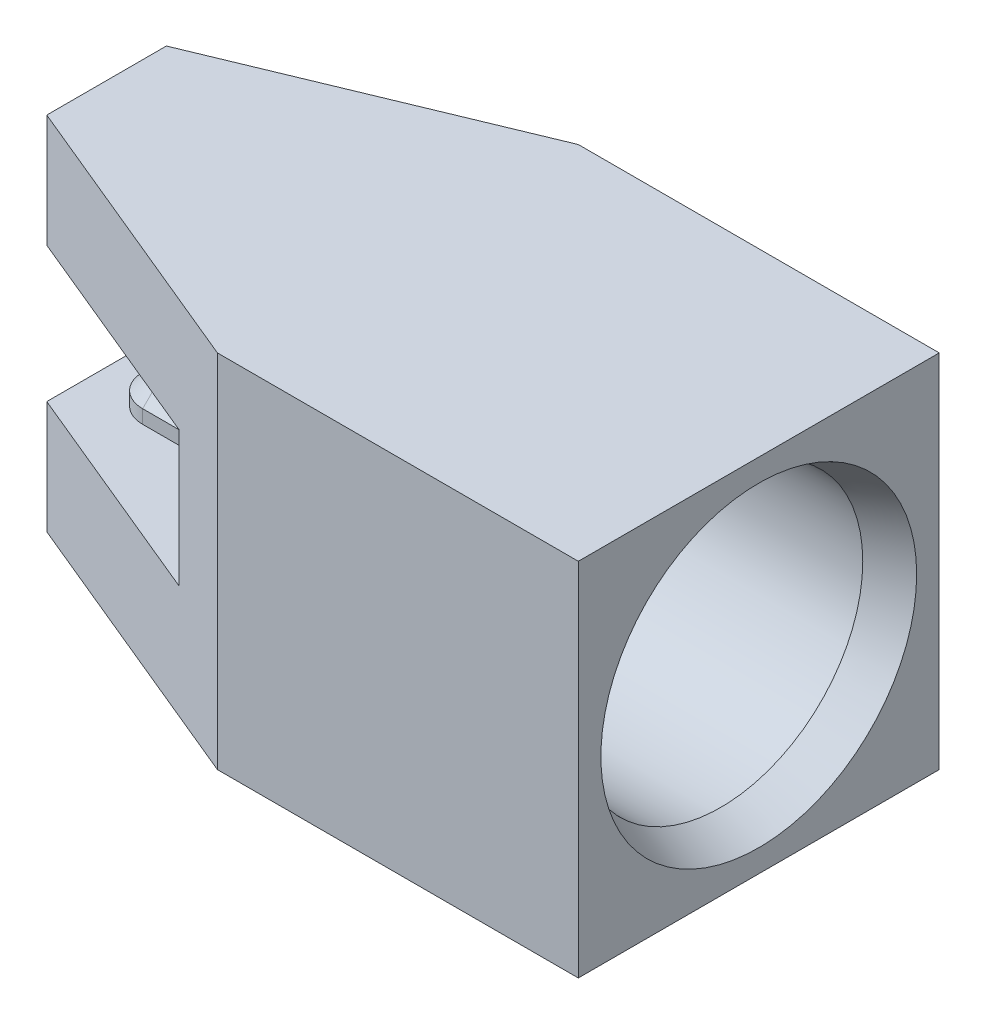
ISO-10303-21;
HEADER;
FILE_DESCRIPTION(('STEP AP214'),'2;1');
FILE_NAME('part.step','',(''),(''),'','','');
FILE_SCHEMA(('AUTOMOTIVE_DESIGN { 1 0 10303 214 1 1 1 1 }'));
ENDSEC;
DATA;
#1=APPLICATION_CONTEXT('core data for automotive mechanical design processes');
#2=APPLICATION_PROTOCOL_DEFINITION('international standard','automotive_design',2000,#1);
#3=PRODUCT_CONTEXT('',#1,'mechanical');
#4=PRODUCT('Part','Part','',(#3));
#5=PRODUCT_RELATED_PRODUCT_CATEGORY('part','',(#4));
#6=PRODUCT_DEFINITION_FORMATION('','',#4);
#7=PRODUCT_DEFINITION_CONTEXT('part definition',#1,'design');
#8=PRODUCT_DEFINITION('design','',#6,#7);
#9=PRODUCT_DEFINITION_SHAPE('','',#8);
#10=(LENGTH_UNIT() NAMED_UNIT(*) SI_UNIT(.MILLI.,.METRE.));
#11=(NAMED_UNIT(*) PLANE_ANGLE_UNIT() SI_UNIT($,.RADIAN.));
#12=(NAMED_UNIT(*) SI_UNIT($,.STERADIAN.) SOLID_ANGLE_UNIT());
#13=UNCERTAINTY_MEASURE_WITH_UNIT(LENGTH_MEASURE(1.E-05),#10,'distance_accuracy_value','');
#14=(GEOMETRIC_REPRESENTATION_CONTEXT(3) GLOBAL_UNCERTAINTY_ASSIGNED_CONTEXT((#13)) GLOBAL_UNIT_ASSIGNED_CONTEXT((#10,
#11,#12)) REPRESENTATION_CONTEXT('',''));
#15=CARTESIAN_POINT('',(0.,0.,0.));
#16=DIRECTION('',(0.,0.,1.));
#17=DIRECTION('',(1.,0.,0.));
#18=AXIS2_PLACEMENT_3D('',#15,#16,#17);
#19=CARTESIAN_POINT('',(0.,1.5,-4.));
#20=DIRECTION('',(0.,1.,0.));
#21=DIRECTION('',(-1.,0.,0.));
#22=AXIS2_PLACEMENT_3D('',#19,#20,#21);
#23=PLANE('',#22);
#24=DIRECTION('',(0.923879532511288,0.,0.382683432365087));
#25=VECTOR('',#24,1.);
#26=CARTESIAN_POINT('',(9.65685424949246,1.50000000000001,4.));
#27=LINE('',#26,#25);
#28=CARTESIAN_POINT('',(3.2,1.50000000000001,1.32548339959389));
#29=VERTEX_POINT('',#28);
#30=CARTESIAN_POINT('',(8.2,1.50000000000001,3.39655121145935));
#31=VERTEX_POINT('',#30);
#32=EDGE_CURVE('E312',#29,#31,#27,.T.);
#33=ORIENTED_EDGE('',*,*,#32,.F.);
#34=DIRECTION('',(0.,0.,-1.));
#35=VECTOR('',#34,1.);
#36=CARTESIAN_POINT('',(3.2,1.5,-4.));
#37=LINE('',#36,#35);
#38=CARTESIAN_POINT('',(3.2,1.5,-1.32548339959389));
#39=VERTEX_POINT('',#38);
#40=EDGE_CURVE('E209',#29,#39,#37,.T.);
#41=ORIENTED_EDGE('',*,*,#40,.T.);
#42=DIRECTION('',(-0.923879532511288,0.,0.382683432365087));
#43=VECTOR('',#42,1.);
#44=CARTESIAN_POINT('',(2.95641450403612,1.5,-1.22458698356828));
#45=LINE('',#44,#43);
#46=CARTESIAN_POINT('',(8.2,1.50000000000001,-3.39655121145935));
#47=VERTEX_POINT('',#46);
#48=EDGE_CURVE('E267',#47,#39,#45,.T.);
#49=ORIENTED_EDGE('',*,*,#48,.F.);
#50=DIRECTION('',(0.,0.,1.));
#51=VECTOR('',#50,1.);
#52=CARTESIAN_POINT('',(8.2,1.50000000000001,-4.));
#53=LINE('',#52,#51);
#54=EDGE_CURVE('E257',#47,#31,#53,.T.);
#55=ORIENTED_EDGE('',*,*,#54,.T.);
#56=EDGE_LOOP('',(#33,#41,#49,#55));
#57=FACE_BOUND('',#56,.T.);
#58=CARTESIAN_POINT('',(4.7,1.5,0.));
#59=DIRECTION('',(0.,-1.,0.));
#60=DIRECTION('',(0.,0.,-1.));
#61=AXIS2_PLACEMENT_3D('',#58,#59,#60);
#62=CIRCLE('',#61,0.7);
#63=CARTESIAN_POINT('',(4.7,1.5,0.7));
#64=VERTEX_POINT('',#63);
#65=CARTESIAN_POINT('',(4.7,1.5,-0.7));
#66=VERTEX_POINT('',#65);
#67=EDGE_CURVE('E235',#64,#66,#62,.T.);
#68=ORIENTED_EDGE('',*,*,#67,.F.);
#69=DIRECTION('',(-1.,0.,0.));
#70=VECTOR('',#69,1.);
#71=CARTESIAN_POINT('',(4.7,1.5,0.7));
#72=LINE('',#71,#70);
#73=CARTESIAN_POINT('',(5.5,1.5,0.7));
#74=VERTEX_POINT('',#73);
#75=EDGE_CURVE('E245',#74,#64,#72,.T.);
#76=ORIENTED_EDGE('',*,*,#75,.F.);
#77=CARTESIAN_POINT('',(5.5,1.5,0.));
#78=DIRECTION('',(0.,-1.,0.));
#79=DIRECTION('',(0.,0.,-1.));
#80=AXIS2_PLACEMENT_3D('',#77,#78,#79);
#81=CIRCLE('',#80,0.7);
#82=CARTESIAN_POINT('',(5.5,1.5,-0.7));
#83=VERTEX_POINT('',#82);
#84=EDGE_CURVE('E242',#83,#74,#81,.T.);
#85=ORIENTED_EDGE('',*,*,#84,.F.);
#86=DIRECTION('',(1.,0.,0.));
#87=VECTOR('',#86,1.);
#88=CARTESIAN_POINT('',(4.7,1.5,-0.7));
#89=LINE('',#88,#87);
#90=EDGE_CURVE('E238',#66,#83,#89,.T.);
#91=ORIENTED_EDGE('',*,*,#90,.F.);
#92=EDGE_LOOP('',(#68,#76,#85,#91));
#93=FACE_BOUND('',#92,.T.);
#94=ADVANCED_FACE('F33',(#57,#93),#23,.F.);
#95=CARTESIAN_POINT('',(17.6568542494925,4.,-4.));
#96=DIRECTION('',(-1.,0.,0.));
#97=DIRECTION('',(0.,0.,1.));
#98=AXIS2_PLACEMENT_3D('',#95,#96,#97);
#99=PLANE('',#98);
#100=CARTESIAN_POINT('',(17.6568542494925,0.,0.));
#101=DIRECTION('',(1.,0.,0.));
#102=DIRECTION('',(0.,0.,-1.));
#103=AXIS2_PLACEMENT_3D('',#100,#101,#102);
#104=CIRCLE('',#103,3.5);
#105=CARTESIAN_POINT('',(17.6568542494925,0.,-3.5));
#106=VERTEX_POINT('',#105);
#107=EDGE_CURVE('E198',#106,#106,#104,.T.);
#108=ORIENTED_EDGE('',*,*,#107,.F.);
#109=EDGE_LOOP('',(#108));
#110=FACE_BOUND('',#109,.T.);
#111=DIRECTION('',(0.,0.,-1.));
#112=VECTOR('',#111,1.);
#113=CARTESIAN_POINT('',(17.6568542494925,-4.,-4.));
#114=LINE('',#113,#112);
#115=CARTESIAN_POINT('',(17.6568542494925,-4.,4.));
#116=VERTEX_POINT('',#115);
#117=CARTESIAN_POINT('',(17.6568542494925,-4.,-4.));
#118=VERTEX_POINT('',#117);
#119=EDGE_CURVE('E270',#116,#118,#114,.T.);
#120=ORIENTED_EDGE('',*,*,#119,.T.);
#121=DIRECTION('',(0.,-1.,0.));
#122=VECTOR('',#121,1.);
#123=CARTESIAN_POINT('',(17.6568542494925,4.,-4.));
#124=LINE('',#123,#122);
#125=CARTESIAN_POINT('',(17.6568542494925,4.,-4.));
#126=VERTEX_POINT('',#125);
#127=EDGE_CURVE('E303',#126,#118,#124,.T.);
#128=ORIENTED_EDGE('',*,*,#127,.F.);
#129=DIRECTION('',(0.,0.,-1.));
#130=VECTOR('',#129,1.);
#131=CARTESIAN_POINT('',(17.6568542494925,4.,-4.));
#132=LINE('',#131,#130);
#133=CARTESIAN_POINT('',(17.6568542494925,4.,4.));
#134=VERTEX_POINT('',#133);
#135=EDGE_CURVE('E271',#134,#126,#132,.T.);
#136=ORIENTED_EDGE('',*,*,#135,.F.);
#137=DIRECTION('',(0.,-1.,0.));
#138=VECTOR('',#137,1.);
#139=CARTESIAN_POINT('',(17.6568542494925,4.,4.));
#140=LINE('',#139,#138);
#141=EDGE_CURVE('E284',#134,#116,#140,.T.);
#142=ORIENTED_EDGE('',*,*,#141,.T.);
#143=EDGE_LOOP('',(#120,#128,#136,#142));
#144=FACE_BOUND('',#143,.T.);
#145=ADVANCED_FACE('F409',(#110,#144),#99,.F.);
#146=CARTESIAN_POINT('',(9.65685424949246,4.,-4.));
#147=DIRECTION('',(0.,0.,1.));
#148=DIRECTION('',(1.,0.,0.));
#149=AXIS2_PLACEMENT_3D('',#146,#147,#148);
#150=PLANE('',#149);
#151=DIRECTION('',(-1.,0.,0.));
#152=VECTOR('',#151,1.);
#153=CARTESIAN_POINT('',(9.65685424949246,-4.,-4.));
#154=LINE('',#153,#152);
#155=CARTESIAN_POINT('',(9.65685424949246,-4.,-4.));
#156=VERTEX_POINT('',#155);
#157=EDGE_CURVE('E287',#118,#156,#154,.T.);
#158=ORIENTED_EDGE('',*,*,#157,.T.);
#159=DIRECTION('',(0.,-1.,0.));
#160=VECTOR('',#159,1.);
#161=CARTESIAN_POINT('',(9.65685424949246,4.,-4.));
#162=LINE('',#161,#160);
#163=CARTESIAN_POINT('',(9.65685424949246,4.,-4.));
#164=VERTEX_POINT('',#163);
#165=EDGE_CURVE('E300',#164,#156,#162,.T.);
#166=ORIENTED_EDGE('',*,*,#165,.F.);
#167=DIRECTION('',(-1.,0.,0.));
#168=VECTOR('',#167,1.);
#169=CARTESIAN_POINT('',(9.65685424949246,4.,-4.));
#170=LINE('',#169,#168);
#171=EDGE_CURVE('E274',#126,#164,#170,.T.);
#172=ORIENTED_EDGE('',*,*,#171,.F.);
#173=ORIENTED_EDGE('',*,*,#127,.T.);
#174=EDGE_LOOP('',(#158,#166,#172,#173));
#175=FACE_BOUND('',#174,.T.);
#176=ADVANCED_FACE('F415',(#175),#150,.F.);
#177=CARTESIAN_POINT('',(2.95641450403612,4.,-1.22458698356828));
#178=DIRECTION('',(0.382683432365087,0.,0.923879532511288));
#179=DIRECTION('',(0.923879532511288,0.,-0.382683432365087));
#180=AXIS2_PLACEMENT_3D('',#177,#178,#179);
#181=PLANE('',#180);
#182=DIRECTION('',(-0.923879532511288,0.,0.382683432365087));
#183=VECTOR('',#182,1.);
#184=CARTESIAN_POINT('',(2.95641450403612,-4.,-1.22458698356828));
#185=LINE('',#184,#183);
#186=CARTESIAN_POINT('',(3.2,-4.,-1.32548339959389));
#187=VERTEX_POINT('',#186);
#188=EDGE_CURVE('E289',#156,#187,#185,.T.);
#189=ORIENTED_EDGE('',*,*,#188,.T.);
#190=DIRECTION('',(0.,1.,0.));
#191=VECTOR('',#190,1.);
#192=CARTESIAN_POINT('',(3.2,4.,-1.32548339959389));
#193=LINE('',#192,#191);
#194=CARTESIAN_POINT('',(3.2,-1.5,-1.32548339959389));
#195=VERTEX_POINT('',#194);
#196=EDGE_CURVE('E204',#187,#195,#193,.T.);
#197=ORIENTED_EDGE('',*,*,#196,.T.);
#198=DIRECTION('',(0.923879532511288,0.,-0.382683432365087));
#199=VECTOR('',#198,1.);
#200=CARTESIAN_POINT('',(2.95641450403612,-1.5,-1.22458698356828));
#201=LINE('',#200,#199);
#202=CARTESIAN_POINT('',(8.2,-1.5,-3.39655121145935));
#203=VERTEX_POINT('',#202);
#204=EDGE_CURVE('E260',#195,#203,#201,.T.);
#205=ORIENTED_EDGE('',*,*,#204,.T.);
#206=DIRECTION('',(0.,1.,0.));
#207=VECTOR('',#206,1.);
#208=CARTESIAN_POINT('',(8.2,4.,-3.39655121145935));
#209=LINE('',#208,#207);
#210=EDGE_CURVE('E264',#203,#47,#209,.T.);
#211=ORIENTED_EDGE('',*,*,#210,.T.);
#212=ORIENTED_EDGE('',*,*,#48,.T.);
#213=CARTESIAN_POINT('',(3.2,4.,-1.32548339959389));
#214=VERTEX_POINT('',#213);
#215=EDGE_CURVE('E208',#39,#214,#193,.T.);
#216=ORIENTED_EDGE('',*,*,#215,.T.);
#217=DIRECTION('',(-0.923879532511288,0.,0.382683432365087));
#218=VECTOR('',#217,1.);
#219=CARTESIAN_POINT('',(2.95641450403612,4.,-1.22458698356828));
#220=LINE('',#219,#218);
#221=EDGE_CURVE('E277',#164,#214,#220,.T.);
#222=ORIENTED_EDGE('',*,*,#221,.F.);
#223=ORIENTED_EDGE('',*,*,#165,.T.);
#224=EDGE_LOOP('',(#189,#197,#205,#211,#212,#216,#222,#223));
#225=FACE_BOUND('',#224,.T.);
#226=ADVANCED_FACE('F445',(#225),#181,.F.);
#227=CARTESIAN_POINT('',(9.65685424949246,4.,4.));
#228=DIRECTION('',(0.382683432365087,0.,-0.923879532511288));
#229=DIRECTION('',(-0.923879532511288,0.,-0.382683432365087));
#230=AXIS2_PLACEMENT_3D('',#227,#228,#229);
#231=PLANE('',#230);
#232=DIRECTION('',(0.923879532511288,0.,0.382683432365087));
#233=VECTOR('',#232,1.);
#234=CARTESIAN_POINT('',(9.65685424949246,4.,4.));
#235=LINE('',#234,#233);
#236=CARTESIAN_POINT('',(3.2,4.,1.32548339959389));
#237=VERTEX_POINT('',#236);
#238=CARTESIAN_POINT('',(9.65685424949246,4.,4.));
#239=VERTEX_POINT('',#238);
#240=EDGE_CURVE('E280',#237,#239,#235,.T.);
#241=ORIENTED_EDGE('',*,*,#240,.F.);
#242=DIRECTION('',(0.,-1.,0.));
#243=VECTOR('',#242,1.);
#244=CARTESIAN_POINT('',(3.2,4.,1.32548339959389));
#245=LINE('',#244,#243);
#246=EDGE_CURVE('E205',#237,#29,#245,.T.);
#247=ORIENTED_EDGE('',*,*,#246,.T.);
#248=ORIENTED_EDGE('',*,*,#32,.T.);
#249=DIRECTION('',(0.,-1.,0.));
#250=VECTOR('',#249,1.);
#251=CARTESIAN_POINT('',(8.2,4.,3.39655121145935));
#252=LINE('',#251,#250);
#253=CARTESIAN_POINT('',(8.2,-1.5,3.39655121145935));
#254=VERTEX_POINT('',#253);
#255=EDGE_CURVE('E309',#31,#254,#252,.T.);
#256=ORIENTED_EDGE('',*,*,#255,.T.);
#257=DIRECTION('',(-0.923879532511288,0.,-0.382683432365087));
#258=VECTOR('',#257,1.);
#259=CARTESIAN_POINT('',(9.65685424949246,-1.5,4.));
#260=LINE('',#259,#258);
#261=CARTESIAN_POINT('',(3.2,-1.5,1.32548339959389));
#262=VERTEX_POINT('',#261);
#263=EDGE_CURVE('E306',#254,#262,#260,.T.);
#264=ORIENTED_EDGE('',*,*,#263,.T.);
#265=CARTESIAN_POINT('',(3.2,-4.,1.32548339959389));
#266=VERTEX_POINT('',#265);
#267=EDGE_CURVE('E48',#262,#266,#245,.T.);
#268=ORIENTED_EDGE('',*,*,#267,.T.);
#269=DIRECTION('',(0.923879532511288,0.,0.382683432365087));
#270=VECTOR('',#269,1.);
#271=CARTESIAN_POINT('',(9.65685424949246,-4.,4.));
#272=LINE('',#271,#270);
#273=CARTESIAN_POINT('',(9.65685424949246,-4.,4.));
#274=VERTEX_POINT('',#273);
#275=EDGE_CURVE('E292',#266,#274,#272,.T.);
#276=ORIENTED_EDGE('',*,*,#275,.T.);
#277=DIRECTION('',(0.,-1.,0.));
#278=VECTOR('',#277,1.);
#279=CARTESIAN_POINT('',(9.65685424949246,4.,4.));
#280=LINE('',#279,#278);
#281=EDGE_CURVE('E297',#239,#274,#280,.T.);
#282=ORIENTED_EDGE('',*,*,#281,.F.);
#283=EDGE_LOOP('',(#241,#247,#248,#256,#264,#268,#276,#282));
#284=FACE_BOUND('',#283,.T.);
#285=ADVANCED_FACE('F441',(#284),#231,.F.);
#286=CARTESIAN_POINT('',(17.6568542494925,4.,4.));
#287=DIRECTION('',(0.,0.,-1.));
#288=DIRECTION('',(-1.,0.,0.));
#289=AXIS2_PLACEMENT_3D('',#286,#287,#288);
#290=PLANE('',#289);
#291=DIRECTION('',(1.,0.,0.));
#292=VECTOR('',#291,1.);
#293=CARTESIAN_POINT('',(17.6568542494925,-4.,4.));
#294=LINE('',#293,#292);
#295=EDGE_CURVE('E275',#274,#116,#294,.T.);
#296=ORIENTED_EDGE('',*,*,#295,.T.);
#297=ORIENTED_EDGE('',*,*,#141,.F.);
#298=DIRECTION('',(1.,0.,0.));
#299=VECTOR('',#298,1.);
#300=CARTESIAN_POINT('',(17.6568542494925,4.,4.));
#301=LINE('',#300,#299);
#302=EDGE_CURVE('E282',#239,#134,#301,.T.);
#303=ORIENTED_EDGE('',*,*,#302,.F.);
#304=ORIENTED_EDGE('',*,*,#281,.T.);
#305=EDGE_LOOP('',(#296,#297,#303,#304));
#306=FACE_BOUND('',#305,.T.);
#307=ADVANCED_FACE('F434',(#306),#290,.F.);
#308=CARTESIAN_POINT('',(0.,4.,0.));
#309=DIRECTION('',(0.,1.,0.));
#310=DIRECTION('',(0.,0.,1.));
#311=AXIS2_PLACEMENT_3D('',#308,#309,#310);
#312=PLANE('',#311);
#313=DIRECTION('',(0.,0.,-1.));
#314=VECTOR('',#313,1.);
#315=CARTESIAN_POINT('',(3.2,4.,-4.));
#316=LINE('',#315,#314);
#317=EDGE_CURVE('E192',#237,#214,#316,.T.);
#318=ORIENTED_EDGE('',*,*,#317,.F.);
#319=ORIENTED_EDGE('',*,*,#240,.T.);
#320=ORIENTED_EDGE('',*,*,#302,.T.);
#321=ORIENTED_EDGE('',*,*,#135,.T.);
#322=ORIENTED_EDGE('',*,*,#171,.T.);
#323=ORIENTED_EDGE('',*,*,#221,.T.);
#324=EDGE_LOOP('',(#318,#319,#320,#321,#322,#323));
#325=FACE_BOUND('',#324,.T.);
#326=ADVANCED_FACE('F431',(#325),#312,.T.);
#327=CARTESIAN_POINT('',(0.,-4.,0.));
#328=DIRECTION('',(0.,1.,0.));
#329=DIRECTION('',(0.,0.,1.));
#330=AXIS2_PLACEMENT_3D('',#327,#328,#329);
#331=PLANE('',#330);
#332=ORIENTED_EDGE('',*,*,#275,.F.);
#333=DIRECTION('',(0.,0.,-1.));
#334=VECTOR('',#333,1.);
#335=CARTESIAN_POINT('',(3.2,-4.,-4.));
#336=LINE('',#335,#334);
#337=EDGE_CURVE('E195',#266,#187,#336,.T.);
#338=ORIENTED_EDGE('',*,*,#337,.T.);
#339=ORIENTED_EDGE('',*,*,#188,.F.);
#340=ORIENTED_EDGE('',*,*,#157,.F.);
#341=ORIENTED_EDGE('',*,*,#119,.F.);
#342=ORIENTED_EDGE('',*,*,#295,.F.);
#343=EDGE_LOOP('',(#332,#338,#339,#340,#341,#342));
#344=FACE_BOUND('',#343,.T.);
#345=ADVANCED_FACE('F427',(#344),#331,.F.);
#346=CARTESIAN_POINT('',(8.2,1.50000000000001,-4.));
#347=DIRECTION('',(1.,0.,0.));
#348=DIRECTION('',(0.,1.,0.));
#349=AXIS2_PLACEMENT_3D('',#346,#347,#348);
#350=PLANE('',#349);
#351=DIRECTION('',(0.,0.,1.));
#352=VECTOR('',#351,1.);
#353=CARTESIAN_POINT('',(8.2,-1.5,-4.));
#354=LINE('',#353,#352);
#355=EDGE_CURVE('E256',#203,#254,#354,.T.);
#356=ORIENTED_EDGE('',*,*,#355,.T.);
#357=ORIENTED_EDGE('',*,*,#255,.F.);
#358=ORIENTED_EDGE('',*,*,#54,.F.);
#359=ORIENTED_EDGE('',*,*,#210,.F.);
#360=EDGE_LOOP('',(#356,#357,#358,#359));
#361=FACE_BOUND('',#360,.T.);
#362=ADVANCED_FACE('F424',(#361),#350,.F.);
#363=CARTESIAN_POINT('',(0.,-1.5,-4.));
#364=DIRECTION('',(0.,-1.,0.));
#365=DIRECTION('',(0.,0.,-1.));
#366=AXIS2_PLACEMENT_3D('',#363,#364,#365);
#367=PLANE('',#366);
#368=DIRECTION('',(-1.,0.,0.));
#369=VECTOR('',#368,1.);
#370=CARTESIAN_POINT('',(4.7,-1.5,0.7));
#371=LINE('',#370,#369);
#372=CARTESIAN_POINT('',(5.5,-1.5,0.7));
#373=VERTEX_POINT('',#372);
#374=CARTESIAN_POINT('',(4.7,-1.5,0.7));
#375=VERTEX_POINT('',#374);
#376=EDGE_CURVE('E216',#373,#375,#371,.T.);
#377=ORIENTED_EDGE('',*,*,#376,.T.);
#378=CARTESIAN_POINT('',(4.7,-1.5,0.));
#379=DIRECTION('',(0.,-1.,0.));
#380=DIRECTION('',(0.,0.,-1.));
#381=AXIS2_PLACEMENT_3D('',#378,#379,#380);
#382=CIRCLE('',#381,0.7);
#383=CARTESIAN_POINT('',(4.7,-1.5,-0.7));
#384=VERTEX_POINT('',#383);
#385=EDGE_CURVE('E213',#375,#384,#382,.T.);
#386=ORIENTED_EDGE('',*,*,#385,.T.);
#387=DIRECTION('',(1.,0.,0.));
#388=VECTOR('',#387,1.);
#389=CARTESIAN_POINT('',(4.7,-1.5,-0.7));
#390=LINE('',#389,#388);
#391=CARTESIAN_POINT('',(5.5,-1.5,-0.7));
#392=VERTEX_POINT('',#391);
#393=EDGE_CURVE('E223',#384,#392,#390,.T.);
#394=ORIENTED_EDGE('',*,*,#393,.T.);
#395=CARTESIAN_POINT('',(5.5,-1.5,0.));
#396=DIRECTION('',(0.,-1.,0.));
#397=DIRECTION('',(0.,0.,-1.));
#398=AXIS2_PLACEMENT_3D('',#395,#396,#397);
#399=CIRCLE('',#398,0.7);
#400=EDGE_CURVE('E220',#392,#373,#399,.T.);
#401=ORIENTED_EDGE('',*,*,#400,.T.);
#402=EDGE_LOOP('',(#377,#386,#394,#401));
#403=FACE_BOUND('',#402,.T.);
#404=ORIENTED_EDGE('',*,*,#204,.F.);
#405=DIRECTION('',(0.,0.,1.));
#406=VECTOR('',#405,1.);
#407=CARTESIAN_POINT('',(3.2,-1.5,-4.));
#408=LINE('',#407,#406);
#409=EDGE_CURVE('E11',#195,#262,#408,.T.);
#410=ORIENTED_EDGE('',*,*,#409,.T.);
#411=ORIENTED_EDGE('',*,*,#263,.F.);
#412=ORIENTED_EDGE('',*,*,#355,.F.);
#413=EDGE_LOOP('',(#404,#410,#411,#412));
#414=FACE_BOUND('',#413,.T.);
#415=ADVANCED_FACE('F393',(#403,#414),#367,.F.);
#416=CARTESIAN_POINT('',(4.7,0.9,0.));
#417=DIRECTION('',(0.,1.,0.));
#418=DIRECTION('',(0.,0.,1.));
#419=AXIS2_PLACEMENT_3D('',#416,#417,#418);
#420=CYLINDRICAL_SURFACE('',#419,0.7);
#421=DIRECTION('',(0.,1.,0.));
#422=VECTOR('',#421,1.);
#423=CARTESIAN_POINT('',(4.7,0.9,-0.7));
#424=LINE('',#423,#422);
#425=CARTESIAN_POINT('',(4.7,1.2,-0.7));
#426=VERTEX_POINT('',#425);
#427=EDGE_CURVE('E254',#426,#66,#424,.T.);
#428=ORIENTED_EDGE('',*,*,#427,.F.);
#429=CARTESIAN_POINT('',(4.7,1.2,0.));
#430=DIRECTION('',(0.,-1.,0.));
#431=DIRECTION('',(0.,0.,-1.));
#432=AXIS2_PLACEMENT_3D('',#429,#430,#431);
#433=CIRCLE('',#432,0.7);
#434=CARTESIAN_POINT('',(4.7,1.2,0.7));
#435=VERTEX_POINT('',#434);
#436=EDGE_CURVE('E328',#426,#435,#433,.F.);
#437=ORIENTED_EDGE('',*,*,#436,.T.);
#438=DIRECTION('',(0.,1.,0.));
#439=VECTOR('',#438,1.);
#440=CARTESIAN_POINT('',(4.7,0.9,0.7));
#441=LINE('',#440,#439);
#442=EDGE_CURVE('E248',#435,#64,#441,.T.);
#443=ORIENTED_EDGE('',*,*,#442,.T.);
#444=ORIENTED_EDGE('',*,*,#67,.T.);
#445=EDGE_LOOP('',(#428,#437,#443,#444));
#446=FACE_BOUND('',#445,.T.);
#447=ADVANCED_FACE('F422',(#446),#420,.T.);
#448=CARTESIAN_POINT('',(4.7,0.9,-0.7));
#449=DIRECTION('',(0.,0.,1.));
#450=DIRECTION('',(1.,0.,0.));
#451=AXIS2_PLACEMENT_3D('',#448,#449,#450);
#452=PLANE('',#451);
#453=DIRECTION('',(0.,1.,0.));
#454=VECTOR('',#453,1.);
#455=CARTESIAN_POINT('',(5.5,0.9,-0.7));
#456=LINE('',#455,#454);
#457=CARTESIAN_POINT('',(5.5,1.2,-0.7));
#458=VERTEX_POINT('',#457);
#459=EDGE_CURVE('E252',#458,#83,#456,.T.);
#460=ORIENTED_EDGE('',*,*,#459,.F.);
#461=DIRECTION('',(-1.,0.,0.));
#462=VECTOR('',#461,1.);
#463=CARTESIAN_POINT('',(4.7,1.2,-0.7));
#464=LINE('',#463,#462);
#465=EDGE_CURVE('E323',#458,#426,#464,.T.);
#466=ORIENTED_EDGE('',*,*,#465,.T.);
#467=ORIENTED_EDGE('',*,*,#427,.T.);
#468=ORIENTED_EDGE('',*,*,#90,.T.);
#469=EDGE_LOOP('',(#460,#466,#467,#468));
#470=FACE_BOUND('',#469,.T.);
#471=ADVANCED_FACE('F639',(#470),#452,.F.);
#472=CARTESIAN_POINT('',(5.5,0.9,0.));
#473=DIRECTION('',(0.,1.,0.));
#474=DIRECTION('',(0.,0.,1.));
#475=AXIS2_PLACEMENT_3D('',#472,#473,#474);
#476=CYLINDRICAL_SURFACE('',#475,0.7);
#477=DIRECTION('',(0.,1.,0.));
#478=VECTOR('',#477,1.);
#479=CARTESIAN_POINT('',(5.5,0.9,0.7));
#480=LINE('',#479,#478);
#481=CARTESIAN_POINT('',(5.5,1.2,0.7));
#482=VERTEX_POINT('',#481);
#483=EDGE_CURVE('E250',#482,#74,#480,.T.);
#484=ORIENTED_EDGE('',*,*,#483,.F.);
#485=CARTESIAN_POINT('',(5.5,1.2,0.));
#486=DIRECTION('',(0.,-1.,0.));
#487=DIRECTION('',(0.,0.,-1.));
#488=AXIS2_PLACEMENT_3D('',#485,#486,#487);
#489=CIRCLE('',#488,0.7);
#490=EDGE_CURVE('E326',#482,#458,#489,.F.);
#491=ORIENTED_EDGE('',*,*,#490,.T.);
#492=ORIENTED_EDGE('',*,*,#459,.T.);
#493=ORIENTED_EDGE('',*,*,#84,.T.);
#494=EDGE_LOOP('',(#484,#491,#492,#493));
#495=FACE_BOUND('',#494,.T.);
#496=ADVANCED_FACE('F630',(#495),#476,.T.);
#497=CARTESIAN_POINT('',(4.7,0.9,0.7));
#498=DIRECTION('',(0.,0.,-1.));
#499=DIRECTION('',(-1.,0.,0.));
#500=AXIS2_PLACEMENT_3D('',#497,#498,#499);
#501=PLANE('',#500);
#502=ORIENTED_EDGE('',*,*,#442,.F.);
#503=DIRECTION('',(1.,0.,0.));
#504=VECTOR('',#503,1.);
#505=CARTESIAN_POINT('',(5.5,1.2,0.7));
#506=LINE('',#505,#504);
#507=EDGE_CURVE('E330',#435,#482,#506,.T.);
#508=ORIENTED_EDGE('',*,*,#507,.T.);
#509=ORIENTED_EDGE('',*,*,#483,.T.);
#510=ORIENTED_EDGE('',*,*,#75,.T.);
#511=EDGE_LOOP('',(#502,#508,#509,#510));
#512=FACE_BOUND('',#511,.T.);
#513=ADVANCED_FACE('F621',(#512),#501,.F.);
#514=CARTESIAN_POINT('',(4.7,0.9,0.));
#515=DIRECTION('',(0.,-1.,0.));
#516=DIRECTION('',(0.,0.,-1.));
#517=AXIS2_PLACEMENT_3D('',#514,#515,#516);
#518=PLANE('',#517);
#519=CARTESIAN_POINT('',(4.7,0.9,0.));
#520=DIRECTION('',(0.,-1.,0.));
#521=DIRECTION('',(0.,0.,-1.));
#522=AXIS2_PLACEMENT_3D('',#519,#520,#521);
#523=CIRCLE('',#522,0.400000000000002);
#524=CARTESIAN_POINT('',(4.7,0.9,0.400000000000002));
#525=VERTEX_POINT('',#524);
#526=CARTESIAN_POINT('',(4.7,0.9,-0.400000000000002));
#527=VERTEX_POINT('',#526);
#528=EDGE_CURVE('E316',#525,#527,#523,.T.);
#529=ORIENTED_EDGE('',*,*,#528,.T.);
#530=DIRECTION('',(1.,0.,0.));
#531=VECTOR('',#530,1.);
#532=CARTESIAN_POINT('',(5.5,0.9,-0.400000000000002));
#533=LINE('',#532,#531);
#534=CARTESIAN_POINT('',(5.5,0.9,-0.400000000000002));
#535=VERTEX_POINT('',#534);
#536=EDGE_CURVE('E320',#527,#535,#533,.T.);
#537=ORIENTED_EDGE('',*,*,#536,.T.);
#538=CARTESIAN_POINT('',(5.5,0.9,0.));
#539=DIRECTION('',(0.,-1.,0.));
#540=DIRECTION('',(0.,0.,-1.));
#541=AXIS2_PLACEMENT_3D('',#538,#539,#540);
#542=CIRCLE('',#541,0.400000000000002);
#543=CARTESIAN_POINT('',(5.5,0.9,0.400000000000002));
#544=VERTEX_POINT('',#543);
#545=EDGE_CURVE('E318',#535,#544,#542,.T.);
#546=ORIENTED_EDGE('',*,*,#545,.T.);
#547=DIRECTION('',(-1.,0.,0.));
#548=VECTOR('',#547,1.);
#549=CARTESIAN_POINT('',(4.7,0.9,0.400000000000002));
#550=LINE('',#549,#548);
#551=EDGE_CURVE('E314',#544,#525,#550,.T.);
#552=ORIENTED_EDGE('',*,*,#551,.T.);
#553=EDGE_LOOP('',(#529,#537,#546,#552));
#554=FACE_BOUND('',#553,.T.);
#555=ADVANCED_FACE('F467',(#554),#518,.T.);
#556=CARTESIAN_POINT('',(4.7,0.9,0.400000000000002));
#557=DIRECTION('',(0.,-0.707106781186545,0.70710678118655));
#558=DIRECTION('',(1.,0.,0.));
#559=AXIS2_PLACEMENT_3D('',#556,#557,#558);
#560=PLANE('',#559);
#561=DIRECTION('',(0.,-0.70710678118655,-0.707106781186545));
#562=VECTOR('',#561,1.);
#563=CARTESIAN_POINT('',(5.5,1.2,0.7));
#564=LINE('',#563,#562);
#565=EDGE_CURVE('E336',#482,#544,#564,.T.);
#566=ORIENTED_EDGE('',*,*,#565,.F.);
#567=ORIENTED_EDGE('',*,*,#507,.F.);
#568=DIRECTION('',(0.,0.70710678118655,0.707106781186545));
#569=VECTOR('',#568,1.);
#570=CARTESIAN_POINT('',(4.7,0.9,0.400000000000002));
#571=LINE('',#570,#569);
#572=EDGE_CURVE('E239',#525,#435,#571,.T.);
#573=ORIENTED_EDGE('',*,*,#572,.F.);
#574=ORIENTED_EDGE('',*,*,#551,.F.);
#575=EDGE_LOOP('',(#566,#567,#573,#574));
#576=FACE_BOUND('',#575,.T.);
#577=ADVANCED_FACE('F463',(#576),#560,.T.);
#578=CARTESIAN_POINT('',(4.7,0.9,0.));
#579=DIRECTION('',(0.,1.,0.));
#580=DIRECTION('',(0.,0.,1.));
#581=AXIS2_PLACEMENT_3D('',#578,#579,#580);
#582=CONICAL_SURFACE('',#581,0.400000000000002,0.785398163397445);
#583=ORIENTED_EDGE('',*,*,#572,.T.);
#584=ORIENTED_EDGE('',*,*,#436,.F.);
#585=DIRECTION('',(0.,0.70710678118655,-0.707106781186545));
#586=VECTOR('',#585,1.);
#587=CARTESIAN_POINT('',(4.7,0.9,-0.400000000000002));
#588=LINE('',#587,#586);
#589=EDGE_CURVE('E334',#527,#426,#588,.T.);
#590=ORIENTED_EDGE('',*,*,#589,.F.);
#591=ORIENTED_EDGE('',*,*,#528,.F.);
#592=EDGE_LOOP('',(#583,#584,#590,#591));
#593=FACE_BOUND('',#592,.T.);
#594=ADVANCED_FACE('F459',(#593),#582,.T.);
#595=CARTESIAN_POINT('',(5.5,0.9,0.));
#596=DIRECTION('',(0.,1.,0.));
#597=DIRECTION('',(0.,0.,1.));
#598=AXIS2_PLACEMENT_3D('',#595,#596,#597);
#599=CONICAL_SURFACE('',#598,0.400000000000002,0.785398163397445);
#600=ORIENTED_EDGE('',*,*,#565,.T.);
#601=ORIENTED_EDGE('',*,*,#545,.F.);
#602=DIRECTION('',(0.,-0.70710678118655,0.707106781186545));
#603=VECTOR('',#602,1.);
#604=CARTESIAN_POINT('',(5.5,1.2,-0.7));
#605=LINE('',#604,#603);
#606=EDGE_CURVE('E234',#458,#535,#605,.T.);
#607=ORIENTED_EDGE('',*,*,#606,.F.);
#608=ORIENTED_EDGE('',*,*,#490,.F.);
#609=EDGE_LOOP('',(#600,#601,#607,#608));
#610=FACE_BOUND('',#609,.T.);
#611=ADVANCED_FACE('F455',(#610),#599,.T.);
#612=CARTESIAN_POINT('',(4.7,0.9,-0.400000000000002));
#613=DIRECTION('',(0.,-0.707106781186545,-0.70710678118655));
#614=DIRECTION('',(-1.,0.,0.));
#615=AXIS2_PLACEMENT_3D('',#612,#613,#614);
#616=PLANE('',#615);
#617=ORIENTED_EDGE('',*,*,#589,.T.);
#618=ORIENTED_EDGE('',*,*,#465,.F.);
#619=ORIENTED_EDGE('',*,*,#606,.T.);
#620=ORIENTED_EDGE('',*,*,#536,.F.);
#621=EDGE_LOOP('',(#617,#618,#619,#620));
#622=FACE_BOUND('',#621,.T.);
#623=ADVANCED_FACE('F406',(#622),#616,.T.);
#624=CARTESIAN_POINT('',(4.7,-0.9,0.));
#625=DIRECTION('',(0.,-1.,0.));
#626=DIRECTION('',(0.,0.,-1.));
#627=AXIS2_PLACEMENT_3D('',#624,#625,#626);
#628=CYLINDRICAL_SURFACE('',#627,0.7);
#629=DIRECTION('',(0.,-1.,0.));
#630=VECTOR('',#629,1.);
#631=CARTESIAN_POINT('',(4.7,-0.9,0.7));
#632=LINE('',#631,#630);
#633=CARTESIAN_POINT('',(4.7,-1.2,0.7));
#634=VERTEX_POINT('',#633);
#635=EDGE_CURVE('E232',#634,#375,#632,.T.);
#636=ORIENTED_EDGE('',*,*,#635,.F.);
#637=CARTESIAN_POINT('',(4.7,-1.2,0.));
#638=DIRECTION('',(0.,1.,0.));
#639=DIRECTION('',(0.,0.,1.));
#640=AXIS2_PLACEMENT_3D('',#637,#638,#639);
#641=CIRCLE('',#640,0.7);
#642=CARTESIAN_POINT('',(4.7,-1.2,-0.7));
#643=VERTEX_POINT('',#642);
#644=EDGE_CURVE('E354',#634,#643,#641,.F.);
#645=ORIENTED_EDGE('',*,*,#644,.T.);
#646=DIRECTION('',(0.,-1.,0.));
#647=VECTOR('',#646,1.);
#648=CARTESIAN_POINT('',(4.7,-0.9,-0.7));
#649=LINE('',#648,#647);
#650=EDGE_CURVE('E226',#643,#384,#649,.T.);
#651=ORIENTED_EDGE('',*,*,#650,.T.);
#652=ORIENTED_EDGE('',*,*,#385,.F.);
#653=EDGE_LOOP('',(#636,#645,#651,#652));
#654=FACE_BOUND('',#653,.T.);
#655=ADVANCED_FACE('F397',(#654),#628,.T.);
#656=CARTESIAN_POINT('',(4.7,-0.9,0.7));
#657=DIRECTION('',(0.,0.,1.));
#658=DIRECTION('',(1.,0.,0.));
#659=AXIS2_PLACEMENT_3D('',#656,#657,#658);
#660=PLANE('',#659);
#661=DIRECTION('',(0.,-1.,0.));
#662=VECTOR('',#661,1.);
#663=CARTESIAN_POINT('',(5.5,-0.9,0.7));
#664=LINE('',#663,#662);
#665=CARTESIAN_POINT('',(5.5,-1.2,0.7));
#666=VERTEX_POINT('',#665);
#667=EDGE_CURVE('E230',#666,#373,#664,.T.);
#668=ORIENTED_EDGE('',*,*,#667,.F.);
#669=DIRECTION('',(-1.,0.,0.));
#670=VECTOR('',#669,1.);
#671=CARTESIAN_POINT('',(4.7,-1.2,0.7));
#672=LINE('',#671,#670);
#673=EDGE_CURVE('E41',#666,#634,#672,.T.);
#674=ORIENTED_EDGE('',*,*,#673,.T.);
#675=ORIENTED_EDGE('',*,*,#635,.T.);
#676=ORIENTED_EDGE('',*,*,#376,.F.);
#677=EDGE_LOOP('',(#668,#674,#675,#676));
#678=FACE_BOUND('',#677,.T.);
#679=ADVANCED_FACE('F398',(#678),#660,.T.);
#680=CARTESIAN_POINT('',(5.5,-0.9,0.));
#681=DIRECTION('',(0.,-1.,0.));
#682=DIRECTION('',(0.,0.,-1.));
#683=AXIS2_PLACEMENT_3D('',#680,#681,#682);
#684=CYLINDRICAL_SURFACE('',#683,0.7);
#685=DIRECTION('',(0.,-1.,0.));
#686=VECTOR('',#685,1.);
#687=CARTESIAN_POINT('',(5.5,-0.9,-0.7));
#688=LINE('',#687,#686);
#689=CARTESIAN_POINT('',(5.5,-1.2,-0.7));
#690=VERTEX_POINT('',#689);
#691=EDGE_CURVE('E228',#690,#392,#688,.T.);
#692=ORIENTED_EDGE('',*,*,#691,.F.);
#693=CARTESIAN_POINT('',(5.5,-1.2,0.));
#694=DIRECTION('',(0.,1.,0.));
#695=DIRECTION('',(0.,0.,1.));
#696=AXIS2_PLACEMENT_3D('',#693,#694,#695);
#697=CIRCLE('',#696,0.7);
#698=EDGE_CURVE('E352',#690,#666,#697,.F.);
#699=ORIENTED_EDGE('',*,*,#698,.T.);
#700=ORIENTED_EDGE('',*,*,#667,.T.);
#701=ORIENTED_EDGE('',*,*,#400,.F.);
#702=EDGE_LOOP('',(#692,#699,#700,#701));
#703=FACE_BOUND('',#702,.T.);
#704=ADVANCED_FACE('F390',(#703),#684,.T.);
#705=CARTESIAN_POINT('',(4.7,-0.9,-0.7));
#706=DIRECTION('',(0.,0.,-1.));
#707=DIRECTION('',(-1.,0.,0.));
#708=AXIS2_PLACEMENT_3D('',#705,#706,#707);
#709=PLANE('',#708);
#710=ORIENTED_EDGE('',*,*,#650,.F.);
#711=DIRECTION('',(1.,0.,0.));
#712=VECTOR('',#711,1.);
#713=CARTESIAN_POINT('',(4.7,-1.2,-0.7));
#714=LINE('',#713,#712);
#715=EDGE_CURVE('E332',#643,#690,#714,.T.);
#716=ORIENTED_EDGE('',*,*,#715,.T.);
#717=ORIENTED_EDGE('',*,*,#691,.T.);
#718=ORIENTED_EDGE('',*,*,#393,.F.);
#719=EDGE_LOOP('',(#710,#716,#717,#718));
#720=FACE_BOUND('',#719,.T.);
#721=ADVANCED_FACE('F387',(#720),#709,.T.);
#722=CARTESIAN_POINT('',(4.7,-0.9,0.));
#723=DIRECTION('',(0.,1.,0.));
#724=DIRECTION('',(0.,0.,-1.));
#725=AXIS2_PLACEMENT_3D('',#722,#723,#724);
#726=PLANE('',#725);
#727=CARTESIAN_POINT('',(5.5,-0.9,0.));
#728=DIRECTION('',(0.,1.,0.));
#729=DIRECTION('',(0.,0.,1.));
#730=AXIS2_PLACEMENT_3D('',#727,#728,#729);
#731=CIRCLE('',#730,0.400000000000002);
#732=CARTESIAN_POINT('',(5.5,-0.9,0.400000000000002));
#733=VERTEX_POINT('',#732);
#734=CARTESIAN_POINT('',(5.5,-0.9,-0.400000000000002));
#735=VERTEX_POINT('',#734);
#736=EDGE_CURVE('E347',#733,#735,#731,.T.);
#737=ORIENTED_EDGE('',*,*,#736,.T.);
#738=DIRECTION('',(-1.,0.,0.));
#739=VECTOR('',#738,1.);
#740=CARTESIAN_POINT('',(4.7,-0.9,-0.400000000000002));
#741=LINE('',#740,#739);
#742=CARTESIAN_POINT('',(4.7,-0.9,-0.400000000000002));
#743=VERTEX_POINT('',#742);
#744=EDGE_CURVE('E349',#735,#743,#741,.T.);
#745=ORIENTED_EDGE('',*,*,#744,.T.);
#746=CARTESIAN_POINT('',(4.7,-0.9,0.));
#747=DIRECTION('',(0.,1.,0.));
#748=DIRECTION('',(0.,0.,1.));
#749=AXIS2_PLACEMENT_3D('',#746,#747,#748);
#750=CIRCLE('',#749,0.400000000000002);
#751=CARTESIAN_POINT('',(4.7,-0.9,0.400000000000002));
#752=VERTEX_POINT('',#751);
#753=EDGE_CURVE('E345',#743,#752,#750,.T.);
#754=ORIENTED_EDGE('',*,*,#753,.T.);
#755=DIRECTION('',(1.,0.,0.));
#756=VECTOR('',#755,1.);
#757=CARTESIAN_POINT('',(4.7,-0.9,0.400000000000002));
#758=LINE('',#757,#756);
#759=EDGE_CURVE('E343',#752,#733,#758,.T.);
#760=ORIENTED_EDGE('',*,*,#759,.T.);
#761=EDGE_LOOP('',(#737,#745,#754,#760));
#762=FACE_BOUND('',#761,.T.);
#763=ADVANCED_FACE('F374',(#762),#726,.T.);
#764=CARTESIAN_POINT('',(4.7,-1.2,0.7));
#765=DIRECTION('',(0.,-0.707106781186545,-0.70710678118655));
#766=DIRECTION('',(-1.,0.,0.));
#767=AXIS2_PLACEMENT_3D('',#764,#765,#766);
#768=PLANE('',#767);
#769=DIRECTION('',(0.,-0.70710678118655,0.707106781186545));
#770=VECTOR('',#769,1.);
#771=CARTESIAN_POINT('',(5.5,-0.9,0.400000000000002));
#772=LINE('',#771,#770);
#773=EDGE_CURVE('E360',#733,#666,#772,.T.);
#774=ORIENTED_EDGE('',*,*,#773,.F.);
#775=ORIENTED_EDGE('',*,*,#759,.F.);
#776=DIRECTION('',(0.,0.70710678118655,-0.707106781186545));
#777=VECTOR('',#776,1.);
#778=CARTESIAN_POINT('',(4.7,-1.2,0.7));
#779=LINE('',#778,#777);
#780=EDGE_CURVE('E217',#634,#752,#779,.T.);
#781=ORIENTED_EDGE('',*,*,#780,.F.);
#782=ORIENTED_EDGE('',*,*,#673,.F.);
#783=EDGE_LOOP('',(#774,#775,#781,#782));
#784=FACE_BOUND('',#783,.T.);
#785=ADVANCED_FACE('F35',(#784),#768,.F.);
#786=CARTESIAN_POINT('',(4.7,-1.2,0.));
#787=DIRECTION('',(0.,-1.,0.));
#788=DIRECTION('',(0.,0.,-1.));
#789=AXIS2_PLACEMENT_3D('',#786,#787,#788);
#790=CONICAL_SURFACE('',#789,0.7,0.785398163397445);
#791=ORIENTED_EDGE('',*,*,#780,.T.);
#792=ORIENTED_EDGE('',*,*,#753,.F.);
#793=DIRECTION('',(0.,0.70710678118655,0.707106781186545));
#794=VECTOR('',#793,1.);
#795=CARTESIAN_POINT('',(4.7,-1.2,-0.7));
#796=LINE('',#795,#794);
#797=EDGE_CURVE('E358',#643,#743,#796,.T.);
#798=ORIENTED_EDGE('',*,*,#797,.F.);
#799=ORIENTED_EDGE('',*,*,#644,.F.);
#800=EDGE_LOOP('',(#791,#792,#798,#799));
#801=FACE_BOUND('',#800,.T.);
#802=ADVANCED_FACE('F367',(#801),#790,.T.);
#803=CARTESIAN_POINT('',(5.5,-1.2,0.));
#804=DIRECTION('',(0.,-1.,0.));
#805=DIRECTION('',(0.,0.,-1.));
#806=AXIS2_PLACEMENT_3D('',#803,#804,#805);
#807=CONICAL_SURFACE('',#806,0.7,0.785398163397445);
#808=ORIENTED_EDGE('',*,*,#773,.T.);
#809=ORIENTED_EDGE('',*,*,#698,.F.);
#810=DIRECTION('',(0.,-0.70710678118655,-0.707106781186545));
#811=VECTOR('',#810,1.);
#812=CARTESIAN_POINT('',(5.5,-0.9,-0.400000000000002));
#813=LINE('',#812,#811);
#814=EDGE_CURVE('E212',#735,#690,#813,.T.);
#815=ORIENTED_EDGE('',*,*,#814,.F.);
#816=ORIENTED_EDGE('',*,*,#736,.F.);
#817=EDGE_LOOP('',(#808,#809,#815,#816));
#818=FACE_BOUND('',#817,.T.);
#819=ADVANCED_FACE('F382',(#818),#807,.T.);
#820=CARTESIAN_POINT('',(4.7,-1.2,-0.7));
#821=DIRECTION('',(0.,-0.707106781186545,0.70710678118655));
#822=DIRECTION('',(1.,0.,0.));
#823=AXIS2_PLACEMENT_3D('',#820,#821,#822);
#824=PLANE('',#823);
#825=ORIENTED_EDGE('',*,*,#797,.T.);
#826=ORIENTED_EDGE('',*,*,#744,.F.);
#827=ORIENTED_EDGE('',*,*,#814,.T.);
#828=ORIENTED_EDGE('',*,*,#715,.F.);
#829=EDGE_LOOP('',(#825,#826,#827,#828));
#830=FACE_BOUND('',#829,.T.);
#831=ADVANCED_FACE('F378',(#830),#824,.F.);
#832=CARTESIAN_POINT('',(3.2,-4.,-4.));
#833=DIRECTION('',(1.,0.,0.));
#834=DIRECTION('',(0.,0.,-1.));
#835=AXIS2_PLACEMENT_3D('',#832,#833,#834);
#836=PLANE('',#835);
#837=ORIENTED_EDGE('',*,*,#337,.F.);
#838=ORIENTED_EDGE('',*,*,#267,.F.);
#839=ORIENTED_EDGE('',*,*,#409,.F.);
#840=ORIENTED_EDGE('',*,*,#196,.F.);
#841=EDGE_LOOP('',(#837,#838,#839,#840));
#842=FACE_BOUND('',#841,.T.);
#843=ADVANCED_FACE('F471',(#842),#836,.F.);
#844=ORIENTED_EDGE('',*,*,#40,.F.);
#845=ORIENTED_EDGE('',*,*,#246,.F.);
#846=ORIENTED_EDGE('',*,*,#317,.T.);
#847=ORIENTED_EDGE('',*,*,#215,.F.);
#848=EDGE_LOOP('',(#844,#845,#846,#847));
#849=FACE_BOUND('',#848,.T.);
#850=ADVANCED_FACE('F186',(#849),#836,.F.);
#851=CARTESIAN_POINT('',(10.1568542494925,0.,0.));
#852=DIRECTION('',(1.,0.,0.));
#853=DIRECTION('',(0.,0.,-1.));
#854=AXIS2_PLACEMENT_3D('',#851,#852,#853);
#855=CONICAL_SURFACE('',#854,3.15,1.02974425867665);
#856=CARTESIAN_POINT('',(8.26414329955564,0.,0.));
#857=VERTEX_POINT('',#856);
#858=VERTEX_LOOP('',#857);
#859=FACE_BOUND('',#858,.T.);
#860=CARTESIAN_POINT('',(10.1568542494925,0.,0.));
#861=DIRECTION('',(1.,0.,0.));
#862=DIRECTION('',(0.,0.,-1.));
#863=AXIS2_PLACEMENT_3D('',#860,#861,#862);
#864=CIRCLE('',#863,3.15);
#865=CARTESIAN_POINT('',(10.1568542494925,0.,-3.15));
#866=VERTEX_POINT('',#865);
#867=EDGE_CURVE('E190',#866,#866,#864,.T.);
#868=ORIENTED_EDGE('',*,*,#867,.T.);
#869=EDGE_LOOP('',(#868));
#870=FACE_BOUND('',#869,.T.);
#871=ADVANCED_FACE('F182',(#859,#870),#855,.F.);
#872=CARTESIAN_POINT('',(17.6568542494925,0.,0.));
#873=DIRECTION('',(1.,0.,0.));
#874=DIRECTION('',(0.,0.,-1.));
#875=AXIS2_PLACEMENT_3D('',#872,#873,#874);
#876=CYLINDRICAL_SURFACE('',#875,3.15);
#877=ORIENTED_EDGE('',*,*,#867,.F.);
#878=EDGE_LOOP('',(#877));
#879=FACE_BOUND('',#878,.T.);
#880=CARTESIAN_POINT('',(16.8118795026619,0.,0.));
#881=DIRECTION('',(1.,0.,0.));
#882=DIRECTION('',(0.,0.,-1.));
#883=AXIS2_PLACEMENT_3D('',#880,#881,#882);
#884=CIRCLE('',#883,3.15);
#885=CARTESIAN_POINT('',(16.8118795026619,0.,-3.15));
#886=VERTEX_POINT('',#885);
#887=EDGE_CURVE('E193',#886,#886,#884,.T.);
#888=ORIENTED_EDGE('',*,*,#887,.T.);
#889=EDGE_LOOP('',(#888));
#890=FACE_BOUND('',#889,.T.);
#891=ADVANCED_FACE('F185',(#879,#890),#876,.F.);
#892=CARTESIAN_POINT('',(17.6568542494925,0.,0.));
#893=DIRECTION('',(1.,0.,0.));
#894=DIRECTION('',(0.,0.,-1.));
#895=AXIS2_PLACEMENT_3D('',#892,#893,#894);
#896=CONICAL_SURFACE('',#895,3.5,0.392699081698723);
#897=ORIENTED_EDGE('',*,*,#887,.F.);
#898=EDGE_LOOP('',(#897));
#899=FACE_BOUND('',#898,.T.);
#900=ORIENTED_EDGE('',*,*,#107,.T.);
#901=EDGE_LOOP('',(#900));
#902=FACE_BOUND('',#901,.T.);
#903=ADVANCED_FACE('F491',(#899,#902),#896,.F.);
#904=CLOSED_SHELL('',(#94,#145,#176,#226,#285,#307,#326,#345,#362,#415,#447,#471,#496,#513,#555,
#577,#594,#611,#623,#655,#679,#704,#721,#763,#785,#802,#819,#831,#843,#850,#871,#891,#903));
#905=MANIFOLD_SOLID_BREP('B2',#904);
#906=ADVANCED_BREP_SHAPE_REPRESENTATION('',(#18,#905),#14);
#907=SHAPE_DEFINITION_REPRESENTATION(#9,#906);
ENDSEC;
END-ISO-10303-21;
